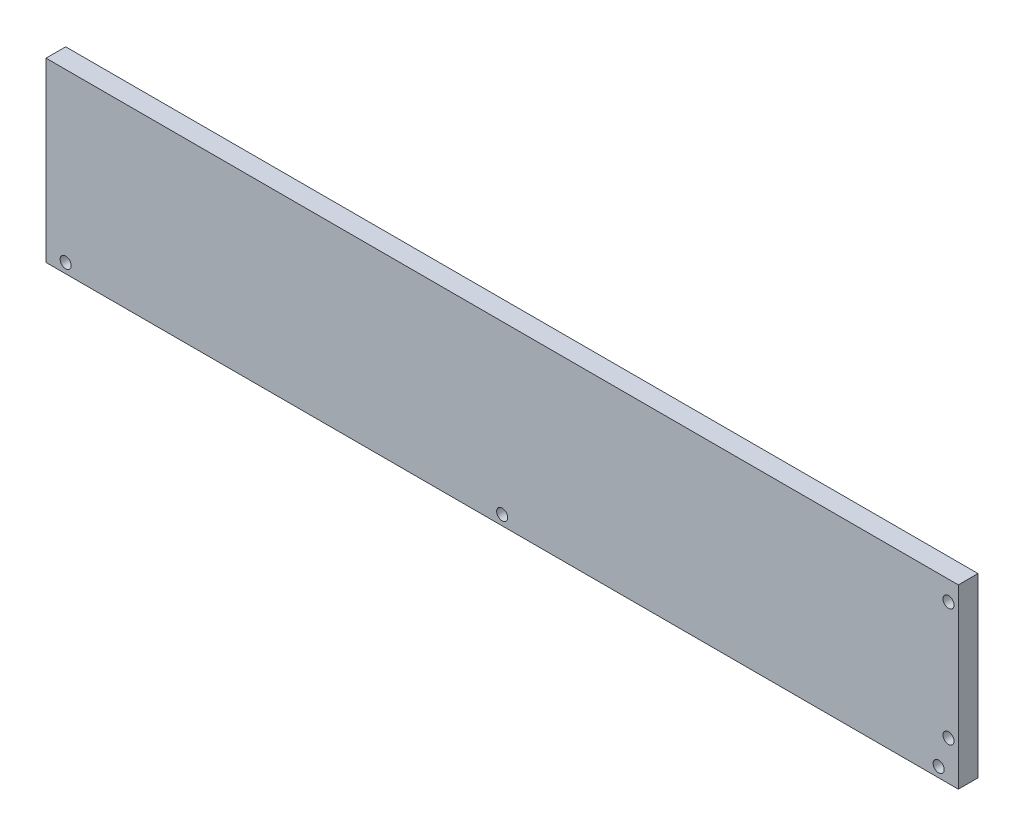
ISO-10303-21;
HEADER;
FILE_DESCRIPTION(('STEP AP214'),'2;1');
FILE_NAME('part.step','',(''),(''),'','','');
FILE_SCHEMA(('AUTOMOTIVE_DESIGN { 1 0 10303 214 1 1 1 1 }'));
ENDSEC;
DATA;
#1=APPLICATION_CONTEXT('core data for automotive mechanical design processes');
#2=APPLICATION_PROTOCOL_DEFINITION('international standard','automotive_design',2000,#1);
#3=PRODUCT_CONTEXT('',#1,'mechanical');
#4=PRODUCT('Part','Part','',(#3));
#5=PRODUCT_RELATED_PRODUCT_CATEGORY('part','',(#4));
#6=PRODUCT_DEFINITION_FORMATION('','',#4);
#7=PRODUCT_DEFINITION_CONTEXT('part definition',#1,'design');
#8=PRODUCT_DEFINITION('design','',#6,#7);
#9=PRODUCT_DEFINITION_SHAPE('','',#8);
#10=(LENGTH_UNIT() NAMED_UNIT(*) SI_UNIT(.MILLI.,.METRE.));
#11=(NAMED_UNIT(*) PLANE_ANGLE_UNIT() SI_UNIT($,.RADIAN.));
#12=(NAMED_UNIT(*) SI_UNIT($,.STERADIAN.) SOLID_ANGLE_UNIT());
#13=UNCERTAINTY_MEASURE_WITH_UNIT(LENGTH_MEASURE(1.E-05),#10,'distance_accuracy_value','');
#14=(GEOMETRIC_REPRESENTATION_CONTEXT(3) GLOBAL_UNCERTAINTY_ASSIGNED_CONTEXT((#13)) GLOBAL_UNIT_ASSIGNED_CONTEXT((#10,
#11,#12)) REPRESENTATION_CONTEXT('',''));
#15=CARTESIAN_POINT('',(0.,0.,0.));
#16=DIRECTION('',(0.,0.,1.));
#17=DIRECTION('',(1.,0.,0.));
#18=AXIS2_PLACEMENT_3D('',#15,#16,#17);
#19=CARTESIAN_POINT('',(0.,0.,6.35));
#20=DIRECTION('',(0.,0.,-1.));
#21=DIRECTION('',(-1.,0.,0.));
#22=AXIS2_PLACEMENT_3D('',#19,#20,#21);
#23=PLANE('',#22);
#24=DIRECTION('',(0.,-1.,0.));
#25=VECTOR('',#24,1.);
#26=CARTESIAN_POINT('',(0.,0.,6.35));
#27=LINE('',#26,#25);
#28=CARTESIAN_POINT('',(0.,57.15,6.35));
#29=VERTEX_POINT('',#28);
#30=CARTESIAN_POINT('',(0.,0.,6.35));
#31=VERTEX_POINT('',#30);
#32=EDGE_CURVE('E92',#29,#31,#27,.T.);
#33=ORIENTED_EDGE('',*,*,#32,.T.);
#34=DIRECTION('',(1.,0.,0.));
#35=VECTOR('',#34,1.);
#36=CARTESIAN_POINT('',(0.,0.,6.35));
#37=LINE('',#36,#35);
#38=CARTESIAN_POINT('',(294.64,0.,6.35));
#39=VERTEX_POINT('',#38);
#40=EDGE_CURVE('E87',#31,#39,#37,.T.);
#41=ORIENTED_EDGE('',*,*,#40,.T.);
#42=DIRECTION('',(0.,1.,0.));
#43=VECTOR('',#42,1.);
#44=CARTESIAN_POINT('',(294.64,0.,6.35));
#45=LINE('',#44,#43);
#46=CARTESIAN_POINT('',(294.64,57.15,6.35));
#47=VERTEX_POINT('',#46);
#48=EDGE_CURVE('E90',#39,#47,#45,.T.);
#49=ORIENTED_EDGE('',*,*,#48,.T.);
#50=DIRECTION('',(-1.,0.,0.));
#51=VECTOR('',#50,1.);
#52=CARTESIAN_POINT('',(0.,57.15,6.35));
#53=LINE('',#52,#51);
#54=EDGE_CURVE('E57',#47,#29,#53,.T.);
#55=ORIENTED_EDGE('',*,*,#54,.T.);
#56=EDGE_LOOP('',(#33,#41,#49,#55));
#57=FACE_BOUND('',#56,.T.);
#58=CARTESIAN_POINT('',(6.35,3.175,6.35));
#59=DIRECTION('',(0.,0.,1.));
#60=DIRECTION('',(1.,0.,0.));
#61=AXIS2_PLACEMENT_3D('',#58,#59,#60);
#62=CIRCLE('',#61,1.7859375);
#63=CARTESIAN_POINT('',(8.1359375,3.175,6.35));
#64=VERTEX_POINT('',#63);
#65=EDGE_CURVE('E112',#64,#64,#62,.T.);
#66=ORIENTED_EDGE('',*,*,#65,.F.);
#67=EDGE_LOOP('',(#66));
#68=FACE_BOUND('',#67,.T.);
#69=CARTESIAN_POINT('',(147.32,3.175,6.35));
#70=DIRECTION('',(0.,0.,1.));
#71=DIRECTION('',(1.,0.,0.));
#72=AXIS2_PLACEMENT_3D('',#69,#70,#71);
#73=CIRCLE('',#72,1.78593749999999);
#74=CARTESIAN_POINT('',(149.1059375,3.175,6.35));
#75=VERTEX_POINT('',#74);
#76=EDGE_CURVE('E134',#75,#75,#73,.T.);
#77=ORIENTED_EDGE('',*,*,#76,.F.);
#78=EDGE_LOOP('',(#77));
#79=FACE_BOUND('',#78,.T.);
#80=CARTESIAN_POINT('',(288.29,3.175,6.35));
#81=DIRECTION('',(0.,0.,1.));
#82=DIRECTION('',(1.,0.,0.));
#83=AXIS2_PLACEMENT_3D('',#80,#81,#82);
#84=CIRCLE('',#83,1.78593749999999);
#85=CARTESIAN_POINT('',(290.0759375,3.175,6.35));
#86=VERTEX_POINT('',#85);
#87=EDGE_CURVE('E142',#86,#86,#84,.T.);
#88=ORIENTED_EDGE('',*,*,#87,.F.);
#89=EDGE_LOOP('',(#88));
#90=FACE_BOUND('',#89,.T.);
#91=CARTESIAN_POINT('',(291.465,50.8,6.35));
#92=DIRECTION('',(0.,0.,1.));
#93=DIRECTION('',(1.,0.,0.));
#94=AXIS2_PLACEMENT_3D('',#91,#92,#93);
#95=CIRCLE('',#94,1.78593749999999);
#96=CARTESIAN_POINT('',(293.2509375,50.8,6.35));
#97=VERTEX_POINT('',#96);
#98=EDGE_CURVE('E150',#97,#97,#95,.T.);
#99=ORIENTED_EDGE('',*,*,#98,.F.);
#100=EDGE_LOOP('',(#99));
#101=FACE_BOUND('',#100,.T.);
#102=CARTESIAN_POINT('',(291.465,12.7,6.35));
#103=DIRECTION('',(0.,0.,1.));
#104=DIRECTION('',(1.,0.,0.));
#105=AXIS2_PLACEMENT_3D('',#102,#103,#104);
#106=CIRCLE('',#105,1.78593749999999);
#107=CARTESIAN_POINT('',(293.2509375,12.7,6.35));
#108=VERTEX_POINT('',#107);
#109=EDGE_CURVE('E158',#108,#108,#106,.T.);
#110=ORIENTED_EDGE('',*,*,#109,.F.);
#111=EDGE_LOOP('',(#110));
#112=FACE_BOUND('',#111,.T.);
#113=ADVANCED_FACE('F39',(#57,#68,#79,#90,#101,#112),#23,.F.);
#114=CARTESIAN_POINT('',(0.,0.,0.));
#115=DIRECTION('',(0.,0.,-1.));
#116=DIRECTION('',(-1.,0.,0.));
#117=AXIS2_PLACEMENT_3D('',#114,#115,#116);
#118=PLANE('',#117);
#119=CARTESIAN_POINT('',(291.465,50.8,0.));
#120=DIRECTION('',(0.,0.,1.));
#121=DIRECTION('',(1.,0.,0.));
#122=AXIS2_PLACEMENT_3D('',#119,#120,#121);
#123=CIRCLE('',#122,1.78593749999999);
#124=CARTESIAN_POINT('',(293.2509375,50.8,0.));
#125=VERTEX_POINT('',#124);
#126=EDGE_CURVE('E154',#125,#125,#123,.T.);
#127=ORIENTED_EDGE('',*,*,#126,.T.);
#128=EDGE_LOOP('',(#127));
#129=FACE_BOUND('',#128,.T.);
#130=CARTESIAN_POINT('',(147.32,3.175,0.));
#131=DIRECTION('',(0.,0.,1.));
#132=DIRECTION('',(1.,0.,0.));
#133=AXIS2_PLACEMENT_3D('',#130,#131,#132);
#134=CIRCLE('',#133,1.78593749999999);
#135=CARTESIAN_POINT('',(149.1059375,3.175,0.));
#136=VERTEX_POINT('',#135);
#137=EDGE_CURVE('E138',#136,#136,#134,.T.);
#138=ORIENTED_EDGE('',*,*,#137,.T.);
#139=EDGE_LOOP('',(#138));
#140=FACE_BOUND('',#139,.T.);
#141=DIRECTION('',(0.,-1.,0.));
#142=VECTOR('',#141,1.);
#143=CARTESIAN_POINT('',(0.,0.,0.));
#144=LINE('',#143,#142);
#145=CARTESIAN_POINT('',(0.,57.15,0.));
#146=VERTEX_POINT('',#145);
#147=CARTESIAN_POINT('',(0.,0.,0.));
#148=VERTEX_POINT('',#147);
#149=EDGE_CURVE('E108',#146,#148,#144,.T.);
#150=ORIENTED_EDGE('',*,*,#149,.F.);
#151=DIRECTION('',(-1.,0.,0.));
#152=VECTOR('',#151,1.);
#153=CARTESIAN_POINT('',(0.,57.15,0.));
#154=LINE('',#153,#152);
#155=CARTESIAN_POINT('',(294.64,57.15,0.));
#156=VERTEX_POINT('',#155);
#157=EDGE_CURVE('E80',#156,#146,#154,.T.);
#158=ORIENTED_EDGE('',*,*,#157,.F.);
#159=DIRECTION('',(0.,1.,0.));
#160=VECTOR('',#159,1.);
#161=CARTESIAN_POINT('',(294.64,0.,0.));
#162=LINE('',#161,#160);
#163=CARTESIAN_POINT('',(294.64,0.,0.));
#164=VERTEX_POINT('',#163);
#165=EDGE_CURVE('E74',#164,#156,#162,.T.);
#166=ORIENTED_EDGE('',*,*,#165,.F.);
#167=DIRECTION('',(1.,0.,0.));
#168=VECTOR('',#167,1.);
#169=CARTESIAN_POINT('',(0.,0.,0.));
#170=LINE('',#169,#168);
#171=EDGE_CURVE('E97',#148,#164,#170,.T.);
#172=ORIENTED_EDGE('',*,*,#171,.F.);
#173=EDGE_LOOP('',(#150,#158,#166,#172));
#174=FACE_BOUND('',#173,.T.);
#175=CARTESIAN_POINT('',(6.35,3.175,0.));
#176=DIRECTION('',(0.,0.,1.));
#177=DIRECTION('',(1.,0.,0.));
#178=AXIS2_PLACEMENT_3D('',#175,#176,#177);
#179=CIRCLE('',#178,1.7859375);
#180=CARTESIAN_POINT('',(8.1359375,3.175,0.));
#181=VERTEX_POINT('',#180);
#182=EDGE_CURVE('E130',#181,#181,#179,.T.);
#183=ORIENTED_EDGE('',*,*,#182,.T.);
#184=EDGE_LOOP('',(#183));
#185=FACE_BOUND('',#184,.T.);
#186=CARTESIAN_POINT('',(288.29,3.175,0.));
#187=DIRECTION('',(0.,0.,1.));
#188=DIRECTION('',(1.,0.,0.));
#189=AXIS2_PLACEMENT_3D('',#186,#187,#188);
#190=CIRCLE('',#189,1.78593749999999);
#191=CARTESIAN_POINT('',(290.0759375,3.175,0.));
#192=VERTEX_POINT('',#191);
#193=EDGE_CURVE('E146',#192,#192,#190,.T.);
#194=ORIENTED_EDGE('',*,*,#193,.T.);
#195=EDGE_LOOP('',(#194));
#196=FACE_BOUND('',#195,.T.);
#197=CARTESIAN_POINT('',(291.465,12.7,0.));
#198=DIRECTION('',(0.,0.,1.));
#199=DIRECTION('',(1.,0.,0.));
#200=AXIS2_PLACEMENT_3D('',#197,#198,#199);
#201=CIRCLE('',#200,1.78593749999999);
#202=CARTESIAN_POINT('',(293.2509375,12.7,0.));
#203=VERTEX_POINT('',#202);
#204=EDGE_CURVE('E162',#203,#203,#201,.T.);
#205=ORIENTED_EDGE('',*,*,#204,.T.);
#206=EDGE_LOOP('',(#205));
#207=FACE_BOUND('',#206,.T.);
#208=ADVANCED_FACE('F125',(#129,#140,#174,#185,#196,#207),#118,.T.);
#209=CARTESIAN_POINT('',(0.,0.,6.35));
#210=DIRECTION('',(1.,0.,0.));
#211=DIRECTION('',(0.,0.,-1.));
#212=AXIS2_PLACEMENT_3D('',#209,#210,#211);
#213=PLANE('',#212);
#214=ORIENTED_EDGE('',*,*,#149,.T.);
#215=DIRECTION('',(0.,0.,-1.));
#216=VECTOR('',#215,1.);
#217=CARTESIAN_POINT('',(0.,0.,6.35));
#218=LINE('',#217,#216);
#219=EDGE_CURVE('E11',#31,#148,#218,.T.);
#220=ORIENTED_EDGE('',*,*,#219,.F.);
#221=ORIENTED_EDGE('',*,*,#32,.F.);
#222=DIRECTION('',(0.,0.,-1.));
#223=VECTOR('',#222,1.);
#224=CARTESIAN_POINT('',(0.,57.15,6.35));
#225=LINE('',#224,#223);
#226=EDGE_CURVE('E104',#29,#146,#225,.T.);
#227=ORIENTED_EDGE('',*,*,#226,.T.);
#228=EDGE_LOOP('',(#214,#220,#221,#227));
#229=FACE_BOUND('',#228,.T.);
#230=ADVANCED_FACE('F41',(#229),#213,.F.);
#231=CARTESIAN_POINT('',(0.,0.,6.35));
#232=DIRECTION('',(0.,1.,0.));
#233=DIRECTION('',(0.,0.,1.));
#234=AXIS2_PLACEMENT_3D('',#231,#232,#233);
#235=PLANE('',#234);
#236=ORIENTED_EDGE('',*,*,#171,.T.);
#237=DIRECTION('',(0.,0.,-1.));
#238=VECTOR('',#237,1.);
#239=CARTESIAN_POINT('',(294.64,0.,6.35));
#240=LINE('',#239,#238);
#241=EDGE_CURVE('E49',#39,#164,#240,.T.);
#242=ORIENTED_EDGE('',*,*,#241,.F.);
#243=ORIENTED_EDGE('',*,*,#40,.F.);
#244=ORIENTED_EDGE('',*,*,#219,.T.);
#245=EDGE_LOOP('',(#236,#242,#243,#244));
#246=FACE_BOUND('',#245,.T.);
#247=ADVANCED_FACE('F96',(#246),#235,.F.);
#248=CARTESIAN_POINT('',(294.64,0.,6.35));
#249=DIRECTION('',(-1.,0.,0.));
#250=DIRECTION('',(0.,0.,1.));
#251=AXIS2_PLACEMENT_3D('',#248,#249,#250);
#252=PLANE('',#251);
#253=ORIENTED_EDGE('',*,*,#165,.T.);
#254=DIRECTION('',(0.,0.,-1.));
#255=VECTOR('',#254,1.);
#256=CARTESIAN_POINT('',(294.64,57.15,6.35));
#257=LINE('',#256,#255);
#258=EDGE_CURVE('E99',#47,#156,#257,.T.);
#259=ORIENTED_EDGE('',*,*,#258,.F.);
#260=ORIENTED_EDGE('',*,*,#48,.F.);
#261=ORIENTED_EDGE('',*,*,#241,.T.);
#262=EDGE_LOOP('',(#253,#259,#260,#261));
#263=FACE_BOUND('',#262,.T.);
#264=ADVANCED_FACE('F100',(#263),#252,.F.);
#265=CARTESIAN_POINT('',(0.,57.15,6.35));
#266=DIRECTION('',(0.,-1.,0.));
#267=DIRECTION('',(0.,0.,-1.));
#268=AXIS2_PLACEMENT_3D('',#265,#266,#267);
#269=PLANE('',#268);
#270=ORIENTED_EDGE('',*,*,#157,.T.);
#271=ORIENTED_EDGE('',*,*,#226,.F.);
#272=ORIENTED_EDGE('',*,*,#54,.F.);
#273=ORIENTED_EDGE('',*,*,#258,.T.);
#274=EDGE_LOOP('',(#270,#271,#272,#273));
#275=FACE_BOUND('',#274,.T.);
#276=ADVANCED_FACE('F122',(#275),#269,.F.);
#277=CARTESIAN_POINT('',(6.35,3.175,6.35));
#278=DIRECTION('',(0.,0.,-1.));
#279=DIRECTION('',(-1.,0.,0.));
#280=AXIS2_PLACEMENT_3D('',#277,#278,#279);
#281=CYLINDRICAL_SURFACE('',#280,1.7859375);
#282=ORIENTED_EDGE('',*,*,#65,.T.);
#283=EDGE_LOOP('',(#282));
#284=FACE_BOUND('',#283,.T.);
#285=ORIENTED_EDGE('',*,*,#182,.F.);
#286=EDGE_LOOP('',(#285));
#287=FACE_BOUND('',#286,.T.);
#288=ADVANCED_FACE('F181',(#284,#287),#281,.F.);
#289=CARTESIAN_POINT('',(147.32,3.175,6.35));
#290=DIRECTION('',(0.,0.,-1.));
#291=DIRECTION('',(-1.,0.,0.));
#292=AXIS2_PLACEMENT_3D('',#289,#290,#291);
#293=CYLINDRICAL_SURFACE('',#292,1.78593749999999);
#294=ORIENTED_EDGE('',*,*,#76,.T.);
#295=EDGE_LOOP('',(#294));
#296=FACE_BOUND('',#295,.T.);
#297=ORIENTED_EDGE('',*,*,#137,.F.);
#298=EDGE_LOOP('',(#297));
#299=FACE_BOUND('',#298,.T.);
#300=ADVANCED_FACE('F227',(#296,#299),#293,.F.);
#301=CARTESIAN_POINT('',(288.29,3.175,6.35));
#302=DIRECTION('',(0.,0.,-1.));
#303=DIRECTION('',(-1.,0.,0.));
#304=AXIS2_PLACEMENT_3D('',#301,#302,#303);
#305=CYLINDRICAL_SURFACE('',#304,1.78593749999999);
#306=ORIENTED_EDGE('',*,*,#87,.T.);
#307=EDGE_LOOP('',(#306));
#308=FACE_BOUND('',#307,.T.);
#309=ORIENTED_EDGE('',*,*,#193,.F.);
#310=EDGE_LOOP('',(#309));
#311=FACE_BOUND('',#310,.T.);
#312=ADVANCED_FACE('F235',(#308,#311),#305,.F.);
#313=CARTESIAN_POINT('',(291.465,50.8,6.35));
#314=DIRECTION('',(0.,0.,-1.));
#315=DIRECTION('',(-1.,0.,0.));
#316=AXIS2_PLACEMENT_3D('',#313,#314,#315);
#317=CYLINDRICAL_SURFACE('',#316,1.78593749999999);
#318=ORIENTED_EDGE('',*,*,#98,.T.);
#319=EDGE_LOOP('',(#318));
#320=FACE_BOUND('',#319,.T.);
#321=ORIENTED_EDGE('',*,*,#126,.F.);
#322=EDGE_LOOP('',(#321));
#323=FACE_BOUND('',#322,.T.);
#324=ADVANCED_FACE('F243',(#320,#323),#317,.F.);
#325=CARTESIAN_POINT('',(291.465,12.7,6.35));
#326=DIRECTION('',(0.,0.,-1.));
#327=DIRECTION('',(-1.,0.,0.));
#328=AXIS2_PLACEMENT_3D('',#325,#326,#327);
#329=CYLINDRICAL_SURFACE('',#328,1.78593749999999);
#330=ORIENTED_EDGE('',*,*,#109,.T.);
#331=EDGE_LOOP('',(#330));
#332=FACE_BOUND('',#331,.T.);
#333=ORIENTED_EDGE('',*,*,#204,.F.);
#334=EDGE_LOOP('',(#333));
#335=FACE_BOUND('',#334,.T.);
#336=ADVANCED_FACE('F170',(#332,#335),#329,.F.);
#337=CLOSED_SHELL('',(#113,#208,#230,#247,#264,#276,#288,#300,#312,#324,#336));
#338=MANIFOLD_SOLID_BREP('B2',#337);
#339=ADVANCED_BREP_SHAPE_REPRESENTATION('',(#18,#338),#14);
#340=SHAPE_DEFINITION_REPRESENTATION(#9,#339);
ENDSEC;
END-ISO-10303-21;
